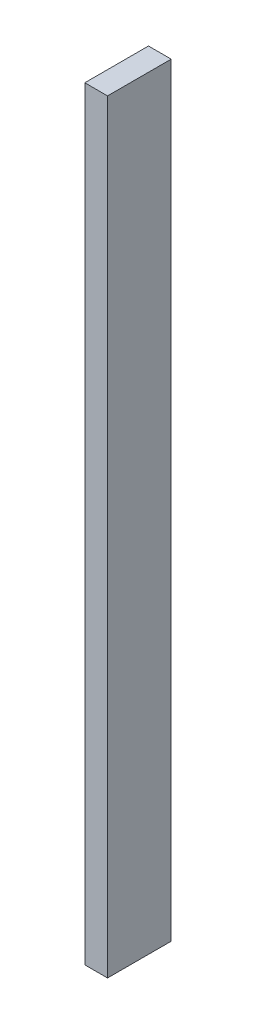
ISO-10303-21;
HEADER;
FILE_DESCRIPTION(('STEP AP214'),'2;1');
FILE_NAME('part.step','',(''),(''),'','','');
FILE_SCHEMA(('AUTOMOTIVE_DESIGN { 1 0 10303 214 1 1 1 1 }'));
ENDSEC;
DATA;
#1=APPLICATION_CONTEXT('core data for automotive mechanical design processes');
#2=APPLICATION_PROTOCOL_DEFINITION('international standard','automotive_design',2000,#1);
#3=PRODUCT_CONTEXT('',#1,'mechanical');
#4=PRODUCT('Part','Part','',(#3));
#5=PRODUCT_RELATED_PRODUCT_CATEGORY('part','',(#4));
#6=PRODUCT_DEFINITION_FORMATION('','',#4);
#7=PRODUCT_DEFINITION_CONTEXT('part definition',#1,'design');
#8=PRODUCT_DEFINITION('design','',#6,#7);
#9=PRODUCT_DEFINITION_SHAPE('','',#8);
#10=(LENGTH_UNIT() NAMED_UNIT(*) SI_UNIT(.MILLI.,.METRE.));
#11=(NAMED_UNIT(*) PLANE_ANGLE_UNIT() SI_UNIT($,.RADIAN.));
#12=(NAMED_UNIT(*) SI_UNIT($,.STERADIAN.) SOLID_ANGLE_UNIT());
#13=UNCERTAINTY_MEASURE_WITH_UNIT(LENGTH_MEASURE(1.E-05),#10,'distance_accuracy_value','');
#14=(GEOMETRIC_REPRESENTATION_CONTEXT(3) GLOBAL_UNCERTAINTY_ASSIGNED_CONTEXT((#13)) GLOBAL_UNIT_ASSIGNED_CONTEXT((#10,
#11,#12)) REPRESENTATION_CONTEXT('',''));
#15=CARTESIAN_POINT('',(0.,0.,0.));
#16=DIRECTION('',(0.,0.,1.));
#17=DIRECTION('',(1.,0.,0.));
#18=AXIS2_PLACEMENT_3D('',#15,#16,#17);
#19=CARTESIAN_POINT('',(0.,106.68,0.));
#20=DIRECTION('',(1.,0.,0.));
#21=DIRECTION('',(0.,0.,-1.));
#22=AXIS2_PLACEMENT_3D('',#19,#20,#21);
#23=PLANE('',#22);
#24=DIRECTION('',(0.,0.,1.));
#25=VECTOR('',#24,1.);
#26=CARTESIAN_POINT('',(0.,0.,0.));
#27=LINE('',#26,#25);
#28=CARTESIAN_POINT('',(0.,0.,-8.89));
#29=VERTEX_POINT('',#28);
#30=CARTESIAN_POINT('',(0.,0.,0.));
#31=VERTEX_POINT('',#30);
#32=EDGE_CURVE('E107',#29,#31,#27,.T.);
#33=ORIENTED_EDGE('',*,*,#32,.T.);
#34=DIRECTION('',(0.,-1.,0.));
#35=VECTOR('',#34,1.);
#36=CARTESIAN_POINT('',(0.,106.68,0.));
#37=LINE('',#36,#35);
#38=CARTESIAN_POINT('',(0.,106.68,0.));
#39=VERTEX_POINT('',#38);
#40=EDGE_CURVE('E11',#39,#31,#37,.T.);
#41=ORIENTED_EDGE('',*,*,#40,.F.);
#42=DIRECTION('',(0.,0.,1.));
#43=VECTOR('',#42,1.);
#44=CARTESIAN_POINT('',(0.,106.68,0.));
#45=LINE('',#44,#43);
#46=CARTESIAN_POINT('',(0.,106.68,-8.89));
#47=VERTEX_POINT('',#46);
#48=EDGE_CURVE('E91',#47,#39,#45,.T.);
#49=ORIENTED_EDGE('',*,*,#48,.F.);
#50=DIRECTION('',(0.,-1.,0.));
#51=VECTOR('',#50,1.);
#52=CARTESIAN_POINT('',(0.,106.68,-8.89));
#53=LINE('',#52,#51);
#54=EDGE_CURVE('E103',#47,#29,#53,.T.);
#55=ORIENTED_EDGE('',*,*,#54,.T.);
#56=EDGE_LOOP('',(#33,#41,#49,#55));
#57=FACE_BOUND('',#56,.T.);
#58=ADVANCED_FACE('F39',(#57),#23,.F.);
#59=CARTESIAN_POINT('',(0.,106.68,0.));
#60=DIRECTION('',(0.,0.,-1.));
#61=DIRECTION('',(-1.,0.,0.));
#62=AXIS2_PLACEMENT_3D('',#59,#60,#61);
#63=PLANE('',#62);
#64=DIRECTION('',(1.,0.,0.));
#65=VECTOR('',#64,1.);
#66=CARTESIAN_POINT('',(0.,0.,0.));
#67=LINE('',#66,#65);
#68=CARTESIAN_POINT('',(3.175,0.,0.));
#69=VERTEX_POINT('',#68);
#70=EDGE_CURVE('E96',#31,#69,#67,.T.);
#71=ORIENTED_EDGE('',*,*,#70,.T.);
#72=DIRECTION('',(0.,-1.,0.));
#73=VECTOR('',#72,1.);
#74=CARTESIAN_POINT('',(3.175,106.68,0.));
#75=LINE('',#74,#73);
#76=CARTESIAN_POINT('',(3.175,106.68,0.));
#77=VERTEX_POINT('',#76);
#78=EDGE_CURVE('E48',#77,#69,#75,.T.);
#79=ORIENTED_EDGE('',*,*,#78,.F.);
#80=DIRECTION('',(1.,0.,0.));
#81=VECTOR('',#80,1.);
#82=CARTESIAN_POINT('',(0.,106.68,0.));
#83=LINE('',#82,#81);
#84=EDGE_CURVE('E86',#39,#77,#83,.T.);
#85=ORIENTED_EDGE('',*,*,#84,.F.);
#86=ORIENTED_EDGE('',*,*,#40,.T.);
#87=EDGE_LOOP('',(#71,#79,#85,#86));
#88=FACE_BOUND('',#87,.T.);
#89=ADVANCED_FACE('F95',(#88),#63,.F.);
#90=CARTESIAN_POINT('',(3.175,106.68,0.));
#91=DIRECTION('',(-1.,0.,0.));
#92=DIRECTION('',(0.,0.,1.));
#93=AXIS2_PLACEMENT_3D('',#90,#91,#92);
#94=PLANE('',#93);
#95=DIRECTION('',(0.,0.,-1.));
#96=VECTOR('',#95,1.);
#97=CARTESIAN_POINT('',(3.175,0.,0.));
#98=LINE('',#97,#96);
#99=CARTESIAN_POINT('',(3.175,0.,-8.89));
#100=VERTEX_POINT('',#99);
#101=EDGE_CURVE('E73',#69,#100,#98,.T.);
#102=ORIENTED_EDGE('',*,*,#101,.T.);
#103=DIRECTION('',(0.,-1.,0.));
#104=VECTOR('',#103,1.);
#105=CARTESIAN_POINT('',(3.175,106.68,-8.89));
#106=LINE('',#105,#104);
#107=CARTESIAN_POINT('',(3.175,106.68,-8.89));
#108=VERTEX_POINT('',#107);
#109=EDGE_CURVE('E98',#108,#100,#106,.T.);
#110=ORIENTED_EDGE('',*,*,#109,.F.);
#111=DIRECTION('',(0.,0.,-1.));
#112=VECTOR('',#111,1.);
#113=CARTESIAN_POINT('',(3.175,106.68,0.));
#114=LINE('',#113,#112);
#115=EDGE_CURVE('E89',#77,#108,#114,.T.);
#116=ORIENTED_EDGE('',*,*,#115,.F.);
#117=ORIENTED_EDGE('',*,*,#78,.T.);
#118=EDGE_LOOP('',(#102,#110,#116,#117));
#119=FACE_BOUND('',#118,.T.);
#120=ADVANCED_FACE('F99',(#119),#94,.F.);
#121=CARTESIAN_POINT('',(0.,106.68,-8.89));
#122=DIRECTION('',(0.,0.,1.));
#123=DIRECTION('',(1.,0.,0.));
#124=AXIS2_PLACEMENT_3D('',#121,#122,#123);
#125=PLANE('',#124);
#126=DIRECTION('',(-1.,0.,0.));
#127=VECTOR('',#126,1.);
#128=CARTESIAN_POINT('',(0.,0.,-8.89));
#129=LINE('',#128,#127);
#130=EDGE_CURVE('E79',#100,#29,#129,.T.);
#131=ORIENTED_EDGE('',*,*,#130,.T.);
#132=ORIENTED_EDGE('',*,*,#54,.F.);
#133=DIRECTION('',(-1.,0.,0.));
#134=VECTOR('',#133,1.);
#135=CARTESIAN_POINT('',(0.,106.68,-8.89));
#136=LINE('',#135,#134);
#137=EDGE_CURVE('E56',#108,#47,#136,.T.);
#138=ORIENTED_EDGE('',*,*,#137,.F.);
#139=ORIENTED_EDGE('',*,*,#109,.T.);
#140=EDGE_LOOP('',(#131,#132,#138,#139));
#141=FACE_BOUND('',#140,.T.);
#142=ADVANCED_FACE('F120',(#141),#125,.F.);
#143=CARTESIAN_POINT('',(0.,106.68,0.));
#144=DIRECTION('',(0.,-1.,0.));
#145=DIRECTION('',(0.,0.,-1.));
#146=AXIS2_PLACEMENT_3D('',#143,#144,#145);
#147=PLANE('',#146);
#148=ORIENTED_EDGE('',*,*,#48,.T.);
#149=ORIENTED_EDGE('',*,*,#84,.T.);
#150=ORIENTED_EDGE('',*,*,#115,.T.);
#151=ORIENTED_EDGE('',*,*,#137,.T.);
#152=EDGE_LOOP('',(#148,#149,#150,#151));
#153=FACE_BOUND('',#152,.T.);
#154=ADVANCED_FACE('F87',(#153),#147,.F.);
#155=CARTESIAN_POINT('',(0.,0.,0.));
#156=DIRECTION('',(0.,-1.,0.));
#157=DIRECTION('',(0.,0.,-1.));
#158=AXIS2_PLACEMENT_3D('',#155,#156,#157);
#159=PLANE('',#158);
#160=ORIENTED_EDGE('',*,*,#32,.F.);
#161=ORIENTED_EDGE('',*,*,#130,.F.);
#162=ORIENTED_EDGE('',*,*,#101,.F.);
#163=ORIENTED_EDGE('',*,*,#70,.F.);
#164=EDGE_LOOP('',(#160,#161,#162,#163));
#165=FACE_BOUND('',#164,.T.);
#166=ADVANCED_FACE('F123',(#165),#159,.T.);
#167=CLOSED_SHELL('',(#58,#89,#120,#142,#154,#166));
#168=MANIFOLD_SOLID_BREP('B2',#167);
#169=ADVANCED_BREP_SHAPE_REPRESENTATION('',(#18,#168),#14);
#170=SHAPE_DEFINITION_REPRESENTATION(#9,#169);
ENDSEC;
END-ISO-10303-21;
